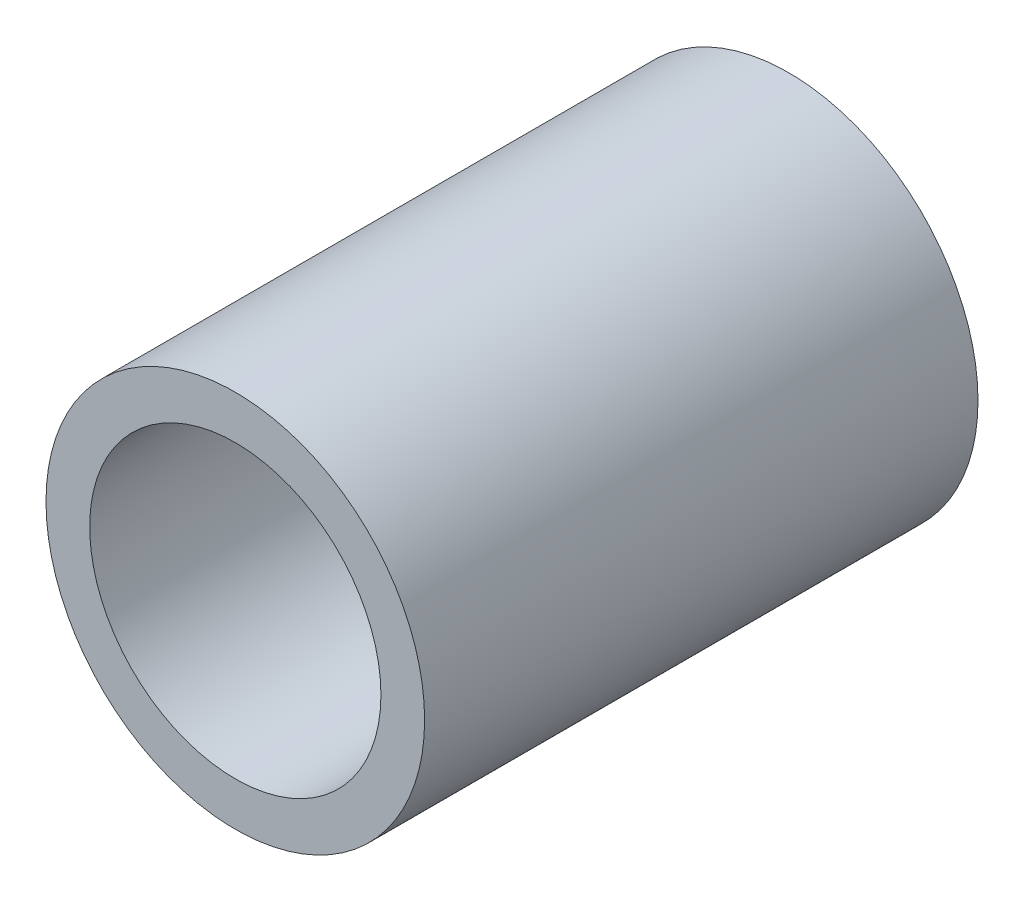
ISO-10303-21;
HEADER;
FILE_DESCRIPTION(('STEP AP214'),'2;1');
FILE_NAME('part.step','',(''),(''),'','','');
FILE_SCHEMA(('AUTOMOTIVE_DESIGN { 1 0 10303 214 1 1 1 1 }'));
ENDSEC;
DATA;
#1=APPLICATION_CONTEXT('core data for automotive mechanical design processes');
#2=APPLICATION_PROTOCOL_DEFINITION('international standard','automotive_design',2000,#1);
#3=PRODUCT_CONTEXT('',#1,'mechanical');
#4=PRODUCT('Part','Part','',(#3));
#5=PRODUCT_RELATED_PRODUCT_CATEGORY('part','',(#4));
#6=PRODUCT_DEFINITION_FORMATION('','',#4);
#7=PRODUCT_DEFINITION_CONTEXT('part definition',#1,'design');
#8=PRODUCT_DEFINITION('design','',#6,#7);
#9=PRODUCT_DEFINITION_SHAPE('','',#8);
#10=(LENGTH_UNIT() NAMED_UNIT(*) SI_UNIT(.MILLI.,.METRE.));
#11=(NAMED_UNIT(*) PLANE_ANGLE_UNIT() SI_UNIT($,.RADIAN.));
#12=(NAMED_UNIT(*) SI_UNIT($,.STERADIAN.) SOLID_ANGLE_UNIT());
#13=UNCERTAINTY_MEASURE_WITH_UNIT(LENGTH_MEASURE(1.E-05),#10,'distance_accuracy_value','');
#14=(GEOMETRIC_REPRESENTATION_CONTEXT(3) GLOBAL_UNCERTAINTY_ASSIGNED_CONTEXT((#13)) GLOBAL_UNIT_ASSIGNED_CONTEXT((#10,
#11,#12)) REPRESENTATION_CONTEXT('',''));
#15=CARTESIAN_POINT('',(0.,0.,0.));
#16=DIRECTION('',(0.,0.,1.));
#17=DIRECTION('',(1.,0.,0.));
#18=AXIS2_PLACEMENT_3D('',#15,#16,#17);
#19=CARTESIAN_POINT('',(0.,0.,9.5));
#20=DIRECTION('',(0.,0.,1.));
#21=DIRECTION('',(1.,0.,0.));
#22=AXIS2_PLACEMENT_3D('',#19,#20,#21);
#23=PLANE('',#22);
#24=CARTESIAN_POINT('',(0.,0.,9.5));
#25=DIRECTION('',(0.,0.,1.));
#26=DIRECTION('',(1.,0.,0.));
#27=AXIS2_PLACEMENT_3D('',#24,#25,#26);
#28=CIRCLE('',#27,3.25);
#29=CARTESIAN_POINT('',(3.25,0.,9.5));
#30=VERTEX_POINT('',#29);
#31=EDGE_CURVE('E10',#30,#30,#28,.T.);
#32=ORIENTED_EDGE('',*,*,#31,.T.);
#33=EDGE_LOOP('',(#32));
#34=FACE_BOUND('',#33,.T.);
#35=CARTESIAN_POINT('',(0.,0.,9.5));
#36=DIRECTION('',(0.,0.,1.));
#37=DIRECTION('',(1.,0.,0.));
#38=AXIS2_PLACEMENT_3D('',#35,#36,#37);
#39=CIRCLE('',#38,2.5);
#40=CARTESIAN_POINT('',(2.5,0.,9.5));
#41=VERTEX_POINT('',#40);
#42=EDGE_CURVE('E43',#41,#41,#39,.T.);
#43=ORIENTED_EDGE('',*,*,#42,.F.);
#44=EDGE_LOOP('',(#43));
#45=FACE_BOUND('',#44,.T.);
#46=ADVANCED_FACE('F32',(#34,#45),#23,.T.);
#47=CARTESIAN_POINT('',(0.,0.,0.));
#48=DIRECTION('',(0.,0.,1.));
#49=DIRECTION('',(1.,0.,0.));
#50=AXIS2_PLACEMENT_3D('',#47,#48,#49);
#51=PLANE('',#50);
#52=CARTESIAN_POINT('',(0.,0.,0.));
#53=DIRECTION('',(0.,0.,1.));
#54=DIRECTION('',(1.,0.,0.));
#55=AXIS2_PLACEMENT_3D('',#52,#53,#54);
#56=CIRCLE('',#55,3.25);
#57=CARTESIAN_POINT('',(3.25,0.,0.));
#58=VERTEX_POINT('',#57);
#59=EDGE_CURVE('E36',#58,#58,#56,.T.);
#60=ORIENTED_EDGE('',*,*,#59,.F.);
#61=EDGE_LOOP('',(#60));
#62=FACE_BOUND('',#61,.T.);
#63=CARTESIAN_POINT('',(0.,0.,0.));
#64=DIRECTION('',(0.,0.,1.));
#65=DIRECTION('',(1.,0.,0.));
#66=AXIS2_PLACEMENT_3D('',#63,#64,#65);
#67=CIRCLE('',#66,2.5);
#68=CARTESIAN_POINT('',(2.5,0.,0.));
#69=VERTEX_POINT('',#68);
#70=EDGE_CURVE('E45',#69,#69,#67,.T.);
#71=ORIENTED_EDGE('',*,*,#70,.T.);
#72=EDGE_LOOP('',(#71));
#73=FACE_BOUND('',#72,.T.);
#74=ADVANCED_FACE('F55',(#62,#73),#51,.F.);
#75=CARTESIAN_POINT('',(0.,0.,9.5));
#76=DIRECTION('',(0.,0.,-1.));
#77=DIRECTION('',(-1.,0.,0.));
#78=AXIS2_PLACEMENT_3D('',#75,#76,#77);
#79=CYLINDRICAL_SURFACE('',#78,3.25);
#80=ORIENTED_EDGE('',*,*,#31,.F.);
#81=EDGE_LOOP('',(#80));
#82=FACE_BOUND('',#81,.T.);
#83=ORIENTED_EDGE('',*,*,#59,.T.);
#84=EDGE_LOOP('',(#83));
#85=FACE_BOUND('',#84,.T.);
#86=ADVANCED_FACE('F34',(#82,#85),#79,.T.);
#87=CARTESIAN_POINT('',(0.,0.,9.5));
#88=DIRECTION('',(0.,0.,-1.));
#89=DIRECTION('',(-1.,0.,0.));
#90=AXIS2_PLACEMENT_3D('',#87,#88,#89);
#91=CYLINDRICAL_SURFACE('',#90,2.5);
#92=ORIENTED_EDGE('',*,*,#42,.T.);
#93=EDGE_LOOP('',(#92));
#94=FACE_BOUND('',#93,.T.);
#95=ORIENTED_EDGE('',*,*,#70,.F.);
#96=EDGE_LOOP('',(#95));
#97=FACE_BOUND('',#96,.T.);
#98=ADVANCED_FACE('F51',(#94,#97),#91,.F.);
#99=CLOSED_SHELL('',(#46,#74,#86,#98));
#100=MANIFOLD_SOLID_BREP('B2',#99);
#101=ADVANCED_BREP_SHAPE_REPRESENTATION('',(#18,#100),#14);
#102=SHAPE_DEFINITION_REPRESENTATION(#9,#101);
ENDSEC;
END-ISO-10303-21;
